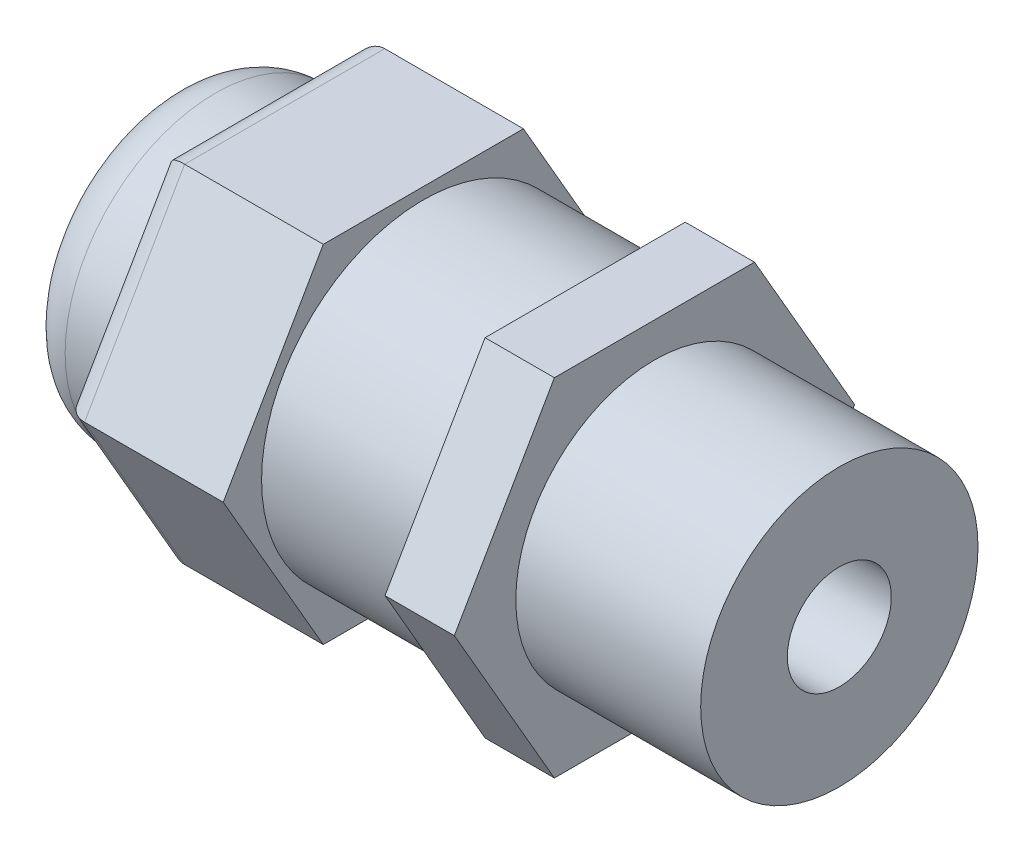
ISO-10303-21;
HEADER;
FILE_DESCRIPTION(('STEP AP214'),'2;1');
FILE_NAME('part.step','',(''),(''),'','','');
FILE_SCHEMA(('AUTOMOTIVE_DESIGN { 1 0 10303 214 1 1 1 1 }'));
ENDSEC;
DATA;
#1=APPLICATION_CONTEXT('core data for automotive mechanical design processes');
#2=APPLICATION_PROTOCOL_DEFINITION('international standard','automotive_design',2000,#1);
#3=PRODUCT_CONTEXT('',#1,'mechanical');
#4=PRODUCT('Part','Part','',(#3));
#5=PRODUCT_RELATED_PRODUCT_CATEGORY('part','',(#4));
#6=PRODUCT_DEFINITION_FORMATION('','',#4);
#7=PRODUCT_DEFINITION_CONTEXT('part definition',#1,'design');
#8=PRODUCT_DEFINITION('design','',#6,#7);
#9=PRODUCT_DEFINITION_SHAPE('','',#8);
#10=(LENGTH_UNIT() NAMED_UNIT(*) SI_UNIT(.MILLI.,.METRE.));
#11=(NAMED_UNIT(*) PLANE_ANGLE_UNIT() SI_UNIT($,.RADIAN.));
#12=(NAMED_UNIT(*) SI_UNIT($,.STERADIAN.) SOLID_ANGLE_UNIT());
#13=UNCERTAINTY_MEASURE_WITH_UNIT(LENGTH_MEASURE(1.E-05),#10,'distance_accuracy_value','');
#14=(GEOMETRIC_REPRESENTATION_CONTEXT(3) GLOBAL_UNCERTAINTY_ASSIGNED_CONTEXT((#13)) GLOBAL_UNIT_ASSIGNED_CONTEXT((#10,
#11,#12)) REPRESENTATION_CONTEXT('',''));
#15=CARTESIAN_POINT('',(0.,0.,0.));
#16=DIRECTION('',(0.,0.,1.));
#17=DIRECTION('',(1.,0.,0.));
#18=AXIS2_PLACEMENT_3D('',#15,#16,#17);
#19=CARTESIAN_POINT('',(-14.,0.,0.));
#20=DIRECTION('',(-1.,0.,0.));
#21=DIRECTION('',(0.,0.,1.));
#22=AXIS2_PLACEMENT_3D('',#19,#20,#21);
#23=PLANE('',#22);
#24=CARTESIAN_POINT('',(-14.,0.,0.));
#25=DIRECTION('',(-1.,0.,0.));
#26=DIRECTION('',(0.,0.,1.));
#27=AXIS2_PLACEMENT_3D('',#24,#25,#26);
#28=CIRCLE('',#27,6.5);
#29=CARTESIAN_POINT('',(-14.,6.49999999999999,0.));
#30=VERTEX_POINT('',#29);
#31=CARTESIAN_POINT('',(-14.,3.24999999999995,-5.62916512459887));
#32=VERTEX_POINT('',#31);
#33=EDGE_CURVE('E191',#30,#32,#28,.T.);
#34=ORIENTED_EDGE('',*,*,#33,.F.);
#35=DIRECTION('',(0.,0.,-1.));
#36=VECTOR('',#35,1.);
#37=CARTESIAN_POINT('',(-14.,6.49999999999997,-4.33012701892224));
#38=LINE('',#37,#36);
#39=CARTESIAN_POINT('',(-14.,6.49999999999997,-3.75277674973261));
#40=VERTEX_POINT('',#39);
#41=EDGE_CURVE('E297',#30,#40,#38,.T.);
#42=ORIENTED_EDGE('',*,*,#41,.T.);
#43=DIRECTION('',(0.,-0.866025403784443,-0.499999999999993));
#44=VECTOR('',#43,1.);
#45=CARTESIAN_POINT('',(-14.,-0.500000000000073,-7.79422863405994));
#46=LINE('',#45,#44);
#47=EDGE_CURVE('E294',#40,#32,#46,.T.);
#48=ORIENTED_EDGE('',*,*,#47,.T.);
#49=EDGE_LOOP('',(#34,#42,#48));
#50=FACE_BOUND('',#49,.T.);
#51=ADVANCED_FACE('F37',(#50),#23,.T.);
#52=CARTESIAN_POINT('',(-14.,-3.25000000000006,-5.62916512459881));
#53=VERTEX_POINT('',#52);
#54=EDGE_CURVE('E338',#32,#53,#28,.T.);
#55=ORIENTED_EDGE('',*,*,#54,.F.);
#56=DIRECTION('',(0.,-0.866025403784443,-0.499999999999993));
#57=VECTOR('',#56,1.);
#58=CARTESIAN_POINT('',(-14.,-0.500000000000073,-7.79422863405994));
#59=LINE('',#58,#57);
#60=CARTESIAN_POINT('',(-14.,0.,-7.50555349946513));
#61=VERTEX_POINT('',#60);
#62=EDGE_CURVE('E292',#32,#61,#59,.T.);
#63=ORIENTED_EDGE('',*,*,#62,.T.);
#64=DIRECTION('',(0.,-0.866025403784433,0.500000000000009));
#65=VECTOR('',#64,1.);
#66=CARTESIAN_POINT('',(-14.,-7.00000000000004,-3.46410161513767));
#67=LINE('',#66,#65);
#68=EDGE_CURVE('E290',#61,#53,#67,.T.);
#69=ORIENTED_EDGE('',*,*,#68,.T.);
#70=EDGE_LOOP('',(#55,#63,#69));
#71=FACE_BOUND('',#70,.T.);
#72=ADVANCED_FACE('F352',(#71),#23,.T.);
#73=CARTESIAN_POINT('',(-14.,-6.50000000000002,0.));
#74=VERTEX_POINT('',#73);
#75=EDGE_CURVE('E334',#53,#74,#28,.T.);
#76=ORIENTED_EDGE('',*,*,#75,.F.);
#77=DIRECTION('',(0.,-0.866025403784433,0.500000000000009));
#78=VECTOR('',#77,1.);
#79=CARTESIAN_POINT('',(-14.,-7.00000000000004,-3.46410161513767));
#80=LINE('',#79,#78);
#81=CARTESIAN_POINT('',(-14.,-6.50000000000005,-3.75277674973249));
#82=VERTEX_POINT('',#81);
#83=EDGE_CURVE('E288',#53,#82,#80,.T.);
#84=ORIENTED_EDGE('',*,*,#83,.T.);
#85=DIRECTION('',(0.,0.,1.));
#86=VECTOR('',#85,1.);
#87=CARTESIAN_POINT('',(-14.,-6.5,4.33012701892219));
#88=LINE('',#87,#86);
#89=EDGE_CURVE('E286',#82,#74,#88,.T.);
#90=ORIENTED_EDGE('',*,*,#89,.T.);
#91=EDGE_LOOP('',(#76,#84,#90));
#92=FACE_BOUND('',#91,.T.);
#93=ADVANCED_FACE('F357',(#92),#23,.T.);
#94=CARTESIAN_POINT('',(-14.,-3.24999999999999,5.62916512459885));
#95=VERTEX_POINT('',#94);
#96=EDGE_CURVE('E329',#74,#95,#28,.T.);
#97=ORIENTED_EDGE('',*,*,#96,.F.);
#98=DIRECTION('',(0.,0.,1.));
#99=VECTOR('',#98,1.);
#100=CARTESIAN_POINT('',(-14.,-6.5,4.33012701892219));
#101=LINE('',#100,#99);
#102=CARTESIAN_POINT('',(-14.,-6.5,3.75277674973256));
#103=VERTEX_POINT('',#102);
#104=EDGE_CURVE('E284',#74,#103,#101,.T.);
#105=ORIENTED_EDGE('',*,*,#104,.T.);
#106=DIRECTION('',(0.,0.866025403784439,0.499999999999999));
#107=VECTOR('',#106,1.);
#108=CARTESIAN_POINT('',(-14.,0.50000000000002,7.79422863405995));
#109=LINE('',#108,#107);
#110=EDGE_CURVE('E282',#103,#95,#109,.T.);
#111=ORIENTED_EDGE('',*,*,#110,.T.);
#112=EDGE_LOOP('',(#97,#105,#111));
#113=FACE_BOUND('',#112,.T.);
#114=ADVANCED_FACE('F361',(#113),#23,.T.);
#115=CARTESIAN_POINT('',(-14.,3.25000000000002,5.62916512459884));
#116=VERTEX_POINT('',#115);
#117=EDGE_CURVE('E193',#95,#116,#28,.T.);
#118=ORIENTED_EDGE('',*,*,#117,.F.);
#119=DIRECTION('',(0.,0.866025403784439,0.499999999999999));
#120=VECTOR('',#119,1.);
#121=CARTESIAN_POINT('',(-14.,0.50000000000002,7.79422863405995));
#122=LINE('',#121,#120);
#123=CARTESIAN_POINT('',(-14.,0.,7.50555349946513));
#124=VERTEX_POINT('',#123);
#125=EDGE_CURVE('E280',#95,#124,#122,.T.);
#126=ORIENTED_EDGE('',*,*,#125,.T.);
#127=DIRECTION('',(0.,0.866025403784437,-0.500000000000003));
#128=VECTOR('',#127,1.);
#129=CARTESIAN_POINT('',(-14.,7.00000000000002,3.46410161513772));
#130=LINE('',#129,#128);
#131=EDGE_CURVE('E276',#124,#116,#130,.T.);
#132=ORIENTED_EDGE('',*,*,#131,.T.);
#133=EDGE_LOOP('',(#118,#126,#132));
#134=FACE_BOUND('',#133,.T.);
#135=ADVANCED_FACE('F365',(#134),#23,.T.);
#136=CARTESIAN_POINT('',(11.,0.,0.));
#137=DIRECTION('',(-1.,0.,0.));
#138=DIRECTION('',(0.,0.,1.));
#139=AXIS2_PLACEMENT_3D('',#136,#137,#138);
#140=PLANE('',#139);
#141=CARTESIAN_POINT('',(11.,0.,0.));
#142=DIRECTION('',(-1.,0.,0.));
#143=DIRECTION('',(0.,0.,1.));
#144=AXIS2_PLACEMENT_3D('',#141,#142,#143);
#145=CIRCLE('',#144,2.25);
#146=CARTESIAN_POINT('',(11.,0.,2.25));
#147=VERTEX_POINT('',#146);
#148=EDGE_CURVE('E312',#147,#147,#145,.T.);
#149=ORIENTED_EDGE('',*,*,#148,.T.);
#150=EDGE_LOOP('',(#149));
#151=FACE_BOUND('',#150,.T.);
#152=CARTESIAN_POINT('',(11.,0.,0.));
#153=DIRECTION('',(-1.,0.,0.));
#154=DIRECTION('',(0.,0.,1.));
#155=AXIS2_PLACEMENT_3D('',#152,#153,#154);
#156=CIRCLE('',#155,6.);
#157=CARTESIAN_POINT('',(11.,0.,6.));
#158=VERTEX_POINT('',#157);
#159=EDGE_CURVE('E263',#158,#158,#156,.T.);
#160=ORIENTED_EDGE('',*,*,#159,.F.);
#161=EDGE_LOOP('',(#160));
#162=FACE_BOUND('',#161,.T.);
#163=ADVANCED_FACE('F409',(#151,#162),#140,.F.);
#164=CARTESIAN_POINT('',(-13.3953488372093,0.,0.));
#165=DIRECTION('',(-1.,0.,0.));
#166=DIRECTION('',(0.,0.,1.));
#167=AXIS2_PLACEMENT_3D('',#164,#165,#166);
#168=CYLINDRICAL_SURFACE('',#167,6.);
#169=CARTESIAN_POINT('',(3.,0.,0.));
#170=DIRECTION('',(1.,0.,0.));
#171=DIRECTION('',(0.,0.,-1.));
#172=AXIS2_PLACEMENT_3D('',#169,#170,#171);
#173=CIRCLE('',#172,6.);
#174=CARTESIAN_POINT('',(3.,0.,-6.));
#175=VERTEX_POINT('',#174);
#176=EDGE_CURVE('E259',#175,#175,#173,.T.);
#177=ORIENTED_EDGE('',*,*,#176,.T.);
#178=EDGE_LOOP('',(#177));
#179=FACE_BOUND('',#178,.T.);
#180=ORIENTED_EDGE('',*,*,#159,.T.);
#181=EDGE_LOOP('',(#180));
#182=FACE_BOUND('',#181,.T.);
#183=ADVANCED_FACE('F414',(#179,#182),#168,.T.);
#184=CARTESIAN_POINT('',(3.,-7.5,4.33012701892219));
#185=DIRECTION('',(0.,1.,0.));
#186=DIRECTION('',(0.,0.,1.));
#187=AXIS2_PLACEMENT_3D('',#184,#185,#186);
#188=PLANE('',#187);
#189=DIRECTION('',(0.,0.,-1.));
#190=VECTOR('',#189,1.);
#191=CARTESIAN_POINT('',(0.,-7.5,4.33012701892219));
#192=LINE('',#191,#190);
#193=CARTESIAN_POINT('',(0.,-7.5,4.33012701892219));
#194=VERTEX_POINT('',#193);
#195=CARTESIAN_POINT('',(0.,-7.5,-4.3301270189222));
#196=VERTEX_POINT('',#195);
#197=EDGE_CURVE('E172',#194,#196,#192,.T.);
#198=ORIENTED_EDGE('',*,*,#197,.T.);
#199=DIRECTION('',(-1.,0.,0.));
#200=VECTOR('',#199,1.);
#201=CARTESIAN_POINT('',(3.,-7.5,-4.3301270189222));
#202=LINE('',#201,#200);
#203=CARTESIAN_POINT('',(3.,-7.5,-4.3301270189222));
#204=VERTEX_POINT('',#203);
#205=EDGE_CURVE('E253',#204,#196,#202,.T.);
#206=ORIENTED_EDGE('',*,*,#205,.F.);
#207=DIRECTION('',(0.,0.,-1.));
#208=VECTOR('',#207,1.);
#209=CARTESIAN_POINT('',(3.,-7.5,4.33012701892219));
#210=LINE('',#209,#208);
#211=CARTESIAN_POINT('',(3.,-7.5,4.33012701892219));
#212=VERTEX_POINT('',#211);
#213=EDGE_CURVE('E213',#212,#204,#210,.T.);
#214=ORIENTED_EDGE('',*,*,#213,.F.);
#215=DIRECTION('',(-1.,0.,0.));
#216=VECTOR('',#215,1.);
#217=CARTESIAN_POINT('',(3.,-7.5,4.33012701892219));
#218=LINE('',#217,#216);
#219=EDGE_CURVE('E227',#212,#194,#218,.T.);
#220=ORIENTED_EDGE('',*,*,#219,.T.);
#221=EDGE_LOOP('',(#198,#206,#214,#220));
#222=FACE_BOUND('',#221,.T.);
#223=ADVANCED_FACE('F528',(#222),#188,.F.);
#224=CARTESIAN_POINT('',(3.,-7.5,-4.3301270189222));
#225=DIRECTION('',(0.,0.5,0.866025403784439));
#226=DIRECTION('',(0.,-0.866025403784439,0.5));
#227=AXIS2_PLACEMENT_3D('',#224,#225,#226);
#228=PLANE('',#227);
#229=DIRECTION('',(0.,0.866025403784439,-0.5));
#230=VECTOR('',#229,1.);
#231=CARTESIAN_POINT('',(0.,-7.5,-4.3301270189222));
#232=LINE('',#231,#230);
#233=CARTESIAN_POINT('',(0.,0.,-8.66025403784439));
#234=VERTEX_POINT('',#233);
#235=EDGE_CURVE('E230',#196,#234,#232,.T.);
#236=ORIENTED_EDGE('',*,*,#235,.T.);
#237=DIRECTION('',(-1.,0.,0.));
#238=VECTOR('',#237,1.);
#239=CARTESIAN_POINT('',(3.,0.,-8.66025403784439));
#240=LINE('',#239,#238);
#241=CARTESIAN_POINT('',(3.,0.,-8.66025403784439));
#242=VERTEX_POINT('',#241);
#243=EDGE_CURVE('E250',#242,#234,#240,.T.);
#244=ORIENTED_EDGE('',*,*,#243,.F.);
#245=DIRECTION('',(0.,0.866025403784439,-0.5));
#246=VECTOR('',#245,1.);
#247=CARTESIAN_POINT('',(3.,-7.5,-4.3301270189222));
#248=LINE('',#247,#246);
#249=EDGE_CURVE('E216',#204,#242,#248,.T.);
#250=ORIENTED_EDGE('',*,*,#249,.F.);
#251=ORIENTED_EDGE('',*,*,#205,.T.);
#252=EDGE_LOOP('',(#236,#244,#250,#251));
#253=FACE_BOUND('',#252,.T.);
#254=ADVANCED_FACE('F518',(#253),#228,.F.);
#255=CARTESIAN_POINT('',(3.,0.,-8.66025403784439));
#256=DIRECTION('',(0.,-0.5,0.866025403784438));
#257=DIRECTION('',(0.,-0.866025403784439,-0.5));
#258=AXIS2_PLACEMENT_3D('',#255,#256,#257);
#259=PLANE('',#258);
#260=DIRECTION('',(0.,0.866025403784439,0.5));
#261=VECTOR('',#260,1.);
#262=CARTESIAN_POINT('',(0.,0.,-8.66025403784439));
#263=LINE('',#262,#261);
#264=CARTESIAN_POINT('',(0.,7.5,-4.33012701892219));
#265=VERTEX_POINT('',#264);
#266=EDGE_CURVE('E232',#234,#265,#263,.T.);
#267=ORIENTED_EDGE('',*,*,#266,.T.);
#268=DIRECTION('',(-1.,0.,0.));
#269=VECTOR('',#268,1.);
#270=CARTESIAN_POINT('',(3.,7.5,-4.33012701892219));
#271=LINE('',#270,#269);
#272=CARTESIAN_POINT('',(3.,7.5,-4.33012701892219));
#273=VERTEX_POINT('',#272);
#274=EDGE_CURVE('E247',#273,#265,#271,.T.);
#275=ORIENTED_EDGE('',*,*,#274,.F.);
#276=DIRECTION('',(0.,0.866025403784439,0.5));
#277=VECTOR('',#276,1.);
#278=CARTESIAN_POINT('',(3.,0.,-8.66025403784439));
#279=LINE('',#278,#277);
#280=EDGE_CURVE('E219',#242,#273,#279,.T.);
#281=ORIENTED_EDGE('',*,*,#280,.F.);
#282=ORIENTED_EDGE('',*,*,#243,.T.);
#283=EDGE_LOOP('',(#267,#275,#281,#282));
#284=FACE_BOUND('',#283,.T.);
#285=ADVANCED_FACE('F508',(#284),#259,.F.);
#286=CARTESIAN_POINT('',(3.,7.5,-4.33012701892219));
#287=DIRECTION('',(0.,-1.,0.));
#288=DIRECTION('',(0.,0.,-1.));
#289=AXIS2_PLACEMENT_3D('',#286,#287,#288);
#290=PLANE('',#289);
#291=DIRECTION('',(0.,0.,1.));
#292=VECTOR('',#291,1.);
#293=CARTESIAN_POINT('',(0.,7.5,-4.33012701892219));
#294=LINE('',#293,#292);
#295=CARTESIAN_POINT('',(0.,7.5,4.3301270189222));
#296=VERTEX_POINT('',#295);
#297=EDGE_CURVE('E234',#265,#296,#294,.T.);
#298=ORIENTED_EDGE('',*,*,#297,.T.);
#299=DIRECTION('',(-1.,0.,0.));
#300=VECTOR('',#299,1.);
#301=CARTESIAN_POINT('',(3.,7.5,4.3301270189222));
#302=LINE('',#301,#300);
#303=CARTESIAN_POINT('',(3.,7.5,4.3301270189222));
#304=VERTEX_POINT('',#303);
#305=EDGE_CURVE('E244',#304,#296,#302,.T.);
#306=ORIENTED_EDGE('',*,*,#305,.F.);
#307=DIRECTION('',(0.,0.,1.));
#308=VECTOR('',#307,1.);
#309=CARTESIAN_POINT('',(3.,7.5,-4.33012701892219));
#310=LINE('',#309,#308);
#311=EDGE_CURVE('E221',#273,#304,#310,.T.);
#312=ORIENTED_EDGE('',*,*,#311,.F.);
#313=ORIENTED_EDGE('',*,*,#274,.T.);
#314=EDGE_LOOP('',(#298,#306,#312,#313));
#315=FACE_BOUND('',#314,.T.);
#316=ADVANCED_FACE('F498',(#315),#290,.F.);
#317=CARTESIAN_POINT('',(3.,7.5,4.3301270189222));
#318=DIRECTION('',(0.,-0.5,-0.866025403784439));
#319=DIRECTION('',(0.,0.866025403784439,-0.5));
#320=AXIS2_PLACEMENT_3D('',#317,#318,#319);
#321=PLANE('',#320);
#322=DIRECTION('',(0.,-0.866025403784439,0.5));
#323=VECTOR('',#322,1.);
#324=CARTESIAN_POINT('',(0.,7.5,4.3301270189222));
#325=LINE('',#324,#323);
#326=CARTESIAN_POINT('',(0.,0.,8.66025403784439));
#327=VERTEX_POINT('',#326);
#328=EDGE_CURVE('E236',#296,#327,#325,.T.);
#329=ORIENTED_EDGE('',*,*,#328,.T.);
#330=DIRECTION('',(-1.,0.,0.));
#331=VECTOR('',#330,1.);
#332=CARTESIAN_POINT('',(3.,0.,8.66025403784439));
#333=LINE('',#332,#331);
#334=CARTESIAN_POINT('',(3.,0.,8.66025403784439));
#335=VERTEX_POINT('',#334);
#336=EDGE_CURVE('E241',#335,#327,#333,.T.);
#337=ORIENTED_EDGE('',*,*,#336,.F.);
#338=DIRECTION('',(0.,-0.866025403784439,0.5));
#339=VECTOR('',#338,1.);
#340=CARTESIAN_POINT('',(3.,7.5,4.3301270189222));
#341=LINE('',#340,#339);
#342=EDGE_CURVE('E223',#304,#335,#341,.T.);
#343=ORIENTED_EDGE('',*,*,#342,.F.);
#344=ORIENTED_EDGE('',*,*,#305,.T.);
#345=EDGE_LOOP('',(#329,#337,#343,#344));
#346=FACE_BOUND('',#345,.T.);
#347=ADVANCED_FACE('F488',(#346),#321,.F.);
#348=CARTESIAN_POINT('',(3.,0.,8.66025403784439));
#349=DIRECTION('',(0.,0.5,-0.866025403784438));
#350=DIRECTION('',(0.,0.866025403784439,0.5));
#351=AXIS2_PLACEMENT_3D('',#348,#349,#350);
#352=PLANE('',#351);
#353=DIRECTION('',(0.,-0.866025403784439,-0.5));
#354=VECTOR('',#353,1.);
#355=CARTESIAN_POINT('',(0.,0.,8.66025403784439));
#356=LINE('',#355,#354);
#357=EDGE_CURVE('E217',#327,#194,#356,.T.);
#358=ORIENTED_EDGE('',*,*,#357,.T.);
#359=ORIENTED_EDGE('',*,*,#219,.F.);
#360=DIRECTION('',(0.,-0.866025403784439,-0.5));
#361=VECTOR('',#360,1.);
#362=CARTESIAN_POINT('',(3.,0.,8.66025403784439));
#363=LINE('',#362,#361);
#364=EDGE_CURVE('E225',#335,#212,#363,.T.);
#365=ORIENTED_EDGE('',*,*,#364,.F.);
#366=ORIENTED_EDGE('',*,*,#336,.T.);
#367=EDGE_LOOP('',(#358,#359,#365,#366));
#368=FACE_BOUND('',#367,.T.);
#369=ADVANCED_FACE('F478',(#368),#352,.F.);
#370=CARTESIAN_POINT('',(3.,0.,0.));
#371=DIRECTION('',(1.,0.,0.));
#372=DIRECTION('',(0.,0.,-1.));
#373=AXIS2_PLACEMENT_3D('',#370,#371,#372);
#374=PLANE('',#373);
#375=ORIENTED_EDGE('',*,*,#176,.F.);
#376=EDGE_LOOP('',(#375));
#377=FACE_BOUND('',#376,.T.);
#378=ORIENTED_EDGE('',*,*,#213,.T.);
#379=ORIENTED_EDGE('',*,*,#249,.T.);
#380=ORIENTED_EDGE('',*,*,#280,.T.);
#381=ORIENTED_EDGE('',*,*,#311,.T.);
#382=ORIENTED_EDGE('',*,*,#342,.T.);
#383=ORIENTED_EDGE('',*,*,#364,.T.);
#384=EDGE_LOOP('',(#378,#379,#380,#381,#382,#383));
#385=FACE_BOUND('',#384,.T.);
#386=ADVANCED_FACE('F466',(#377,#385),#374,.T.);
#387=CARTESIAN_POINT('',(0.,0.,0.));
#388=DIRECTION('',(1.,0.,0.));
#389=DIRECTION('',(0.,0.,-1.));
#390=AXIS2_PLACEMENT_3D('',#387,#388,#389);
#391=PLANE('',#390);
#392=CARTESIAN_POINT('',(0.,0.,0.));
#393=DIRECTION('',(1.,0.,0.));
#394=DIRECTION('',(0.,0.,-1.));
#395=AXIS2_PLACEMENT_3D('',#392,#393,#394);
#396=CIRCLE('',#395,7.);
#397=CARTESIAN_POINT('',(0.,0.,-7.));
#398=VERTEX_POINT('',#397);
#399=EDGE_CURVE('E256',#398,#398,#396,.T.);
#400=ORIENTED_EDGE('',*,*,#399,.T.);
#401=EDGE_LOOP('',(#400));
#402=FACE_BOUND('',#401,.T.);
#403=ORIENTED_EDGE('',*,*,#197,.F.);
#404=ORIENTED_EDGE('',*,*,#357,.F.);
#405=ORIENTED_EDGE('',*,*,#328,.F.);
#406=ORIENTED_EDGE('',*,*,#297,.F.);
#407=ORIENTED_EDGE('',*,*,#266,.F.);
#408=ORIENTED_EDGE('',*,*,#235,.F.);
#409=EDGE_LOOP('',(#403,#404,#405,#406,#407,#408));
#410=FACE_BOUND('',#409,.T.);
#411=ADVANCED_FACE('F460',(#402,#410),#391,.F.);
#412=CARTESIAN_POINT('',(-13.3953488372093,0.,0.));
#413=DIRECTION('',(-1.,0.,0.));
#414=DIRECTION('',(0.,0.,1.));
#415=AXIS2_PLACEMENT_3D('',#412,#413,#414);
#416=CYLINDRICAL_SURFACE('',#415,7.);
#417=CARTESIAN_POINT('',(-7.,0.,0.));
#418=DIRECTION('',(-1.,0.,0.));
#419=DIRECTION('',(0.,0.,1.));
#420=AXIS2_PLACEMENT_3D('',#417,#418,#419);
#421=CIRCLE('',#420,7.);
#422=CARTESIAN_POINT('',(-7.,0.,7.));
#423=VERTEX_POINT('',#422);
#424=EDGE_CURVE('E260',#423,#423,#421,.T.);
#425=ORIENTED_EDGE('',*,*,#424,.F.);
#426=EDGE_LOOP('',(#425));
#427=FACE_BOUND('',#426,.T.);
#428=ORIENTED_EDGE('',*,*,#399,.F.);
#429=EDGE_LOOP('',(#428));
#430=FACE_BOUND('',#429,.T.);
#431=ADVANCED_FACE('F465',(#427,#430),#416,.T.);
#432=CARTESIAN_POINT('',(-14.,-7.50000000000005,-4.3301270189221));
#433=DIRECTION('',(0.,1.,0.));
#434=DIRECTION('',(0.,0.,1.));
#435=AXIS2_PLACEMENT_3D('',#432,#433,#434);
#436=PLANE('',#435);
#437=DIRECTION('',(1.,0.,0.));
#438=VECTOR('',#437,1.);
#439=CARTESIAN_POINT('',(-14.,-7.5,4.33012701892219));
#440=LINE('',#439,#438);
#441=CARTESIAN_POINT('',(-13.,-7.5,4.33012701892219));
#442=VERTEX_POINT('',#441);
#443=CARTESIAN_POINT('',(-7.,-7.5,4.33012701892219));
#444=VERTEX_POINT('',#443);
#445=EDGE_CURVE('E162',#442,#444,#440,.T.);
#446=ORIENTED_EDGE('',*,*,#445,.F.);
#447=DIRECTION('',(0.,0.,1.));
#448=VECTOR('',#447,1.);
#449=CARTESIAN_POINT('',(-13.,-7.50000000000005,-4.3301270189221));
#450=LINE('',#449,#448);
#451=CARTESIAN_POINT('',(-13.,-7.50000000000005,-4.3301270189221));
#452=VERTEX_POINT('',#451);
#453=EDGE_CURVE('E304',#442,#452,#450,.F.);
#454=ORIENTED_EDGE('',*,*,#453,.T.);
#455=DIRECTION('',(1.,0.,0.));
#456=VECTOR('',#455,1.);
#457=CARTESIAN_POINT('',(-14.,-7.50000000000005,-4.3301270189221));
#458=LINE('',#457,#456);
#459=CARTESIAN_POINT('',(-7.,-7.50000000000005,-4.3301270189221));
#460=VERTEX_POINT('',#459);
#461=EDGE_CURVE('E186',#452,#460,#458,.T.);
#462=ORIENTED_EDGE('',*,*,#461,.T.);
#463=DIRECTION('',(0.,0.,1.));
#464=VECTOR('',#463,1.);
#465=CARTESIAN_POINT('',(-7.,-7.50000000000005,-4.3301270189221));
#466=LINE('',#465,#464);
#467=EDGE_CURVE('E179',#460,#444,#466,.T.);
#468=ORIENTED_EDGE('',*,*,#467,.T.);
#469=EDGE_LOOP('',(#446,#454,#462,#468));
#470=FACE_BOUND('',#469,.T.);
#471=ADVANCED_FACE('F184',(#470),#436,.F.);
#472=CARTESIAN_POINT('',(-14.,-7.5,4.33012701892219));
#473=DIRECTION('',(0.,0.499999999999999,-0.866025403784439));
#474=DIRECTION('',(0.,0.866025403784439,0.499999999999999));
#475=AXIS2_PLACEMENT_3D('',#472,#473,#474);
#476=PLANE('',#475);
#477=DIRECTION('',(1.,0.,0.));
#478=VECTOR('',#477,1.);
#479=CARTESIAN_POINT('',(-14.,0.,8.66025403784439));
#480=LINE('',#479,#478);
#481=CARTESIAN_POINT('',(-13.,0.,8.66025403784439));
#482=VERTEX_POINT('',#481);
#483=CARTESIAN_POINT('',(-7.,0.,8.66025403784439));
#484=VERTEX_POINT('',#483);
#485=EDGE_CURVE('E173',#482,#484,#480,.T.);
#486=ORIENTED_EDGE('',*,*,#485,.F.);
#487=DIRECTION('',(0.,0.866025403784439,0.499999999999999));
#488=VECTOR('',#487,1.);
#489=CARTESIAN_POINT('',(-13.,-7.5,4.33012701892219));
#490=LINE('',#489,#488);
#491=EDGE_CURVE('E168',#482,#442,#490,.F.);
#492=ORIENTED_EDGE('',*,*,#491,.T.);
#493=ORIENTED_EDGE('',*,*,#445,.T.);
#494=DIRECTION('',(0.,0.866025403784439,0.499999999999999));
#495=VECTOR('',#494,1.);
#496=CARTESIAN_POINT('',(-7.,-7.5,4.33012701892219));
#497=LINE('',#496,#495);
#498=EDGE_CURVE('E165',#444,#484,#497,.T.);
#499=ORIENTED_EDGE('',*,*,#498,.T.);
#500=EDGE_LOOP('',(#486,#492,#493,#499));
#501=FACE_BOUND('',#500,.T.);
#502=ADVANCED_FACE('F164',(#501),#476,.F.);
#503=CARTESIAN_POINT('',(-14.,0.,8.66025403784439));
#504=DIRECTION('',(0.,-0.500000000000003,-0.866025403784437));
#505=DIRECTION('',(0.,0.866025403784437,-0.500000000000003));
#506=AXIS2_PLACEMENT_3D('',#503,#504,#505);
#507=PLANE('',#506);
#508=DIRECTION('',(1.,0.,0.));
#509=VECTOR('',#508,1.);
#510=CARTESIAN_POINT('',(-14.,7.50000000000002,4.33012701892216));
#511=LINE('',#510,#509);
#512=CARTESIAN_POINT('',(-13.,7.50000000000002,4.33012701892216));
#513=VERTEX_POINT('',#512);
#514=CARTESIAN_POINT('',(-7.,7.50000000000002,4.33012701892216));
#515=VERTEX_POINT('',#514);
#516=EDGE_CURVE('E210',#513,#515,#511,.T.);
#517=ORIENTED_EDGE('',*,*,#516,.F.);
#518=DIRECTION('',(0.,0.866025403784437,-0.500000000000003));
#519=VECTOR('',#518,1.);
#520=CARTESIAN_POINT('',(-13.,0.,8.66025403784439));
#521=LINE('',#520,#519);
#522=EDGE_CURVE('E11',#513,#482,#521,.F.);
#523=ORIENTED_EDGE('',*,*,#522,.T.);
#524=ORIENTED_EDGE('',*,*,#485,.T.);
#525=DIRECTION('',(0.,0.866025403784437,-0.500000000000003));
#526=VECTOR('',#525,1.);
#527=CARTESIAN_POINT('',(-7.,0.,8.66025403784439));
#528=LINE('',#527,#526);
#529=EDGE_CURVE('E182',#484,#515,#528,.T.);
#530=ORIENTED_EDGE('',*,*,#529,.T.);
#531=EDGE_LOOP('',(#517,#523,#524,#530));
#532=FACE_BOUND('',#531,.T.);
#533=ADVANCED_FACE('F385',(#532),#507,.F.);
#534=CARTESIAN_POINT('',(-14.,7.50000000000002,4.33012701892216));
#535=DIRECTION('',(0.,-1.,0.));
#536=DIRECTION('',(0.,0.,-1.));
#537=AXIS2_PLACEMENT_3D('',#534,#535,#536);
#538=PLANE('',#537);
#539=DIRECTION('',(1.,0.,0.));
#540=VECTOR('',#539,1.);
#541=CARTESIAN_POINT('',(-14.,7.49999999999997,-4.33012701892225));
#542=LINE('',#541,#540);
#543=CARTESIAN_POINT('',(-13.,7.49999999999997,-4.33012701892225));
#544=VERTEX_POINT('',#543);
#545=CARTESIAN_POINT('',(-7.,7.49999999999997,-4.33012701892225));
#546=VERTEX_POINT('',#545);
#547=EDGE_CURVE('E208',#544,#546,#542,.T.);
#548=ORIENTED_EDGE('',*,*,#547,.F.);
#549=DIRECTION('',(0.,0.,-1.));
#550=VECTOR('',#549,1.);
#551=CARTESIAN_POINT('',(-13.,7.50000000000002,4.33012701892216));
#552=LINE('',#551,#550);
#553=EDGE_CURVE('E46',#544,#513,#552,.F.);
#554=ORIENTED_EDGE('',*,*,#553,.T.);
#555=ORIENTED_EDGE('',*,*,#516,.T.);
#556=DIRECTION('',(0.,0.,-1.));
#557=VECTOR('',#556,1.);
#558=CARTESIAN_POINT('',(-7.,7.50000000000002,4.33012701892216));
#559=LINE('',#558,#557);
#560=EDGE_CURVE('E197',#515,#546,#559,.T.);
#561=ORIENTED_EDGE('',*,*,#560,.T.);
#562=EDGE_LOOP('',(#548,#554,#555,#561));
#563=FACE_BOUND('',#562,.T.);
#564=ADVANCED_FACE('F384',(#563),#538,.F.);
#565=CARTESIAN_POINT('',(-14.,7.49999999999997,-4.33012701892225));
#566=DIRECTION('',(0.,-0.499999999999993,0.866025403784443));
#567=DIRECTION('',(0.,-0.866025403784443,-0.499999999999993));
#568=AXIS2_PLACEMENT_3D('',#565,#566,#567);
#569=PLANE('',#568);
#570=DIRECTION('',(1.,0.,0.));
#571=VECTOR('',#570,1.);
#572=CARTESIAN_POINT('',(-14.,0.,-8.66025403784439));
#573=LINE('',#572,#571);
#574=CARTESIAN_POINT('',(-13.,0.,-8.66025403784439));
#575=VERTEX_POINT('',#574);
#576=CARTESIAN_POINT('',(-7.,0.,-8.66025403784439));
#577=VERTEX_POINT('',#576);
#578=EDGE_CURVE('E206',#575,#577,#573,.T.);
#579=ORIENTED_EDGE('',*,*,#578,.F.);
#580=DIRECTION('',(0.,-0.866025403784443,-0.499999999999993));
#581=VECTOR('',#580,1.);
#582=CARTESIAN_POINT('',(-13.,7.49999999999997,-4.33012701892225));
#583=LINE('',#582,#581);
#584=EDGE_CURVE('E299',#575,#544,#583,.F.);
#585=ORIENTED_EDGE('',*,*,#584,.T.);
#586=ORIENTED_EDGE('',*,*,#547,.T.);
#587=DIRECTION('',(0.,-0.866025403784443,-0.499999999999993));
#588=VECTOR('',#587,1.);
#589=CARTESIAN_POINT('',(-7.,7.49999999999997,-4.33012701892225));
#590=LINE('',#589,#588);
#591=EDGE_CURVE('E200',#546,#577,#590,.T.);
#592=ORIENTED_EDGE('',*,*,#591,.T.);
#593=EDGE_LOOP('',(#579,#585,#586,#592));
#594=FACE_BOUND('',#593,.T.);
#595=ADVANCED_FACE('F382',(#594),#569,.F.);
#596=CARTESIAN_POINT('',(-14.,0.,-8.66025403784439));
#597=DIRECTION('',(0.,0.500000000000009,0.866025403784433));
#598=DIRECTION('',(0.,-0.866025403784433,0.500000000000009));
#599=AXIS2_PLACEMENT_3D('',#596,#597,#598);
#600=PLANE('',#599);
#601=ORIENTED_EDGE('',*,*,#461,.F.);
#602=DIRECTION('',(0.,-0.866025403784433,0.500000000000009));
#603=VECTOR('',#602,1.);
#604=CARTESIAN_POINT('',(-13.,0.,-8.66025403784439));
#605=LINE('',#604,#603);
#606=EDGE_CURVE('E302',#452,#575,#605,.F.);
#607=ORIENTED_EDGE('',*,*,#606,.T.);
#608=ORIENTED_EDGE('',*,*,#578,.T.);
#609=DIRECTION('',(0.,-0.866025403784433,0.500000000000009));
#610=VECTOR('',#609,1.);
#611=CARTESIAN_POINT('',(-7.,0.,-8.66025403784439));
#612=LINE('',#611,#610);
#613=EDGE_CURVE('E203',#577,#460,#612,.T.);
#614=ORIENTED_EDGE('',*,*,#613,.T.);
#615=EDGE_LOOP('',(#601,#607,#608,#614));
#616=FACE_BOUND('',#615,.T.);
#617=ADVANCED_FACE('F381',(#616),#600,.F.);
#618=DIRECTION('',(0.,0.866025403784437,-0.500000000000003));
#619=VECTOR('',#618,1.);
#620=CARTESIAN_POINT('',(-14.,7.00000000000002,3.46410161513772));
#621=LINE('',#620,#619);
#622=CARTESIAN_POINT('',(-14.,6.50000000000002,3.75277674973254));
#623=VERTEX_POINT('',#622);
#624=EDGE_CURVE('E274',#116,#623,#621,.T.);
#625=ORIENTED_EDGE('',*,*,#624,.T.);
#626=DIRECTION('',(0.,0.,-1.));
#627=VECTOR('',#626,1.);
#628=CARTESIAN_POINT('',(-14.,6.49999999999997,-4.33012701892224));
#629=LINE('',#628,#627);
#630=EDGE_CURVE('E278',#623,#30,#629,.T.);
#631=ORIENTED_EDGE('',*,*,#630,.T.);
#632=EDGE_CURVE('E188',#116,#30,#28,.T.);
#633=ORIENTED_EDGE('',*,*,#632,.F.);
#634=EDGE_LOOP('',(#625,#631,#633));
#635=FACE_BOUND('',#634,.T.);
#636=ADVANCED_FACE('F371',(#635),#23,.T.);
#637=CARTESIAN_POINT('',(-7.,0.,0.));
#638=DIRECTION('',(-1.,0.,0.));
#639=DIRECTION('',(0.,0.,1.));
#640=AXIS2_PLACEMENT_3D('',#637,#638,#639);
#641=PLANE('',#640);
#642=ORIENTED_EDGE('',*,*,#424,.T.);
#643=EDGE_LOOP('',(#642));
#644=FACE_BOUND('',#643,.T.);
#645=ORIENTED_EDGE('',*,*,#467,.F.);
#646=ORIENTED_EDGE('',*,*,#613,.F.);
#647=ORIENTED_EDGE('',*,*,#591,.F.);
#648=ORIENTED_EDGE('',*,*,#560,.F.);
#649=ORIENTED_EDGE('',*,*,#529,.F.);
#650=ORIENTED_EDGE('',*,*,#498,.F.);
#651=EDGE_LOOP('',(#645,#646,#647,#648,#649,#650));
#652=FACE_BOUND('',#651,.T.);
#653=ADVANCED_FACE('F177',(#644,#652),#641,.F.);
#654=CARTESIAN_POINT('',(-18.,0.,0.));
#655=DIRECTION('',(1.,0.,0.));
#656=DIRECTION('',(0.,0.,-1.));
#657=AXIS2_PLACEMENT_3D('',#654,#655,#656);
#658=CYLINDRICAL_SURFACE('',#657,6.5);
#659=CARTESIAN_POINT('',(-16.,0.,0.));
#660=DIRECTION('',(-1.,0.,0.));
#661=DIRECTION('',(0.,0.,1.));
#662=AXIS2_PLACEMENT_3D('',#659,#660,#661);
#663=CIRCLE('',#662,6.5);
#664=CARTESIAN_POINT('',(-16.,0.,6.5));
#665=VERTEX_POINT('',#664);
#666=EDGE_CURVE('E271',#665,#665,#663,.F.);
#667=ORIENTED_EDGE('',*,*,#666,.T.);
#668=EDGE_LOOP('',(#667));
#669=FACE_BOUND('',#668,.T.);
#670=ORIENTED_EDGE('',*,*,#632,.T.);
#671=ORIENTED_EDGE('',*,*,#33,.T.);
#672=ORIENTED_EDGE('',*,*,#54,.T.);
#673=ORIENTED_EDGE('',*,*,#75,.T.);
#674=ORIENTED_EDGE('',*,*,#96,.T.);
#675=ORIENTED_EDGE('',*,*,#117,.T.);
#676=EDGE_LOOP('',(#670,#671,#672,#673,#674,#675));
#677=FACE_BOUND('',#676,.T.);
#678=ADVANCED_FACE('F345',(#669,#677),#658,.T.);
#679=CARTESIAN_POINT('',(-18.,0.,0.));
#680=DIRECTION('',(-1.,0.,0.));
#681=DIRECTION('',(0.,0.,1.));
#682=AXIS2_PLACEMENT_3D('',#679,#680,#681);
#683=PLANE('',#682);
#684=CARTESIAN_POINT('',(-18.,0.,0.));
#685=DIRECTION('',(-1.,0.,0.));
#686=DIRECTION('',(0.,0.,1.));
#687=AXIS2_PLACEMENT_3D('',#684,#685,#686);
#688=CIRCLE('',#687,2.25);
#689=CARTESIAN_POINT('',(-18.,0.,2.25));
#690=VERTEX_POINT('',#689);
#691=EDGE_CURVE('E668',#690,#690,#688,.T.);
#692=ORIENTED_EDGE('',*,*,#691,.F.);
#693=EDGE_LOOP('',(#692));
#694=FACE_BOUND('',#693,.T.);
#695=CARTESIAN_POINT('',(-18.,0.,0.));
#696=DIRECTION('',(-1.,0.,0.));
#697=DIRECTION('',(0.,0.,1.));
#698=AXIS2_PLACEMENT_3D('',#695,#696,#697);
#699=CIRCLE('',#698,4.5);
#700=CARTESIAN_POINT('',(-18.,0.,4.5));
#701=VERTEX_POINT('',#700);
#702=EDGE_CURVE('E266',#701,#701,#699,.T.);
#703=ORIENTED_EDGE('',*,*,#702,.T.);
#704=EDGE_LOOP('',(#703));
#705=FACE_BOUND('',#704,.T.);
#706=ADVANCED_FACE('F441',(#694,#705),#683,.T.);
#707=CARTESIAN_POINT('',(-16.,0.,0.));
#708=DIRECTION('',(-1.,0.,0.));
#709=DIRECTION('',(0.,0.,1.));
#710=AXIS2_PLACEMENT_3D('',#707,#708,#709);
#711=TOROIDAL_SURFACE('',#710,4.5,2.);
#712=ORIENTED_EDGE('',*,*,#666,.F.);
#713=EDGE_LOOP('',(#712));
#714=FACE_BOUND('',#713,.T.);
#715=ORIENTED_EDGE('',*,*,#702,.F.);
#716=EDGE_LOOP('',(#715));
#717=FACE_BOUND('',#716,.T.);
#718=ADVANCED_FACE('F436',(#714,#717),#711,.T.);
#719=CARTESIAN_POINT('',(-13.,-3.24999999999999,5.62916512459885));
#720=DIRECTION('',(0.,-0.866025403784439,-0.499999999999999));
#721=DIRECTION('',(0.,0.499999999999999,-0.866025403784439));
#722=AXIS2_PLACEMENT_3D('',#719,#720,#721);
#723=CYLINDRICAL_SURFACE('',#722,1.);
#724=CARTESIAN_POINT('',(-13.,-6.5,3.75277674973256));
#725=DIRECTION('',(0.,-0.500000000000003,-0.866025403784437));
#726=DIRECTION('',(0.,-0.866025403784437,0.500000000000003));
#727=AXIS2_PLACEMENT_3D('',#724,#725,#726);
#728=ELLIPSE('',#727,1.15470053837925,1.);
#729=EDGE_CURVE('E319',#442,#103,#728,.T.);
#730=ORIENTED_EDGE('',*,*,#729,.F.);
#731=ORIENTED_EDGE('',*,*,#491,.F.);
#732=CARTESIAN_POINT('',(-13.,0.,7.50555349946513));
#733=DIRECTION('',(0.,-1.,0.));
#734=DIRECTION('',(0.,0.,1.));
#735=AXIS2_PLACEMENT_3D('',#732,#733,#734);
#736=ELLIPSE('',#735,1.15470053837925,1.);
#737=EDGE_CURVE('E41',#124,#482,#736,.F.);
#738=ORIENTED_EDGE('',*,*,#737,.F.);
#739=ORIENTED_EDGE('',*,*,#125,.F.);
#740=ORIENTED_EDGE('',*,*,#110,.F.);
#741=EDGE_LOOP('',(#730,#731,#738,#739,#740));
#742=FACE_BOUND('',#741,.T.);
#743=ADVANCED_FACE('F39',(#742),#723,.T.);
#744=CARTESIAN_POINT('',(-13.,3.25000000000002,5.62916512459884));
#745=DIRECTION('',(0.,-0.866025403784437,0.500000000000003));
#746=DIRECTION('',(0.,-0.500000000000003,-0.866025403784437));
#747=AXIS2_PLACEMENT_3D('',#744,#745,#746);
#748=CYLINDRICAL_SURFACE('',#747,1.);
#749=ORIENTED_EDGE('',*,*,#737,.T.);
#750=ORIENTED_EDGE('',*,*,#522,.F.);
#751=CARTESIAN_POINT('',(-13.,6.50000000000002,3.75277674973254));
#752=DIRECTION('',(0.,-0.499999999999996,0.866025403784441));
#753=DIRECTION('',(0.,-0.866025403784441,-0.499999999999996));
#754=AXIS2_PLACEMENT_3D('',#751,#752,#753);
#755=ELLIPSE('',#754,1.15470053837925,1.);
#756=EDGE_CURVE('E317',#623,#513,#755,.F.);
#757=ORIENTED_EDGE('',*,*,#756,.F.);
#758=ORIENTED_EDGE('',*,*,#624,.F.);
#759=ORIENTED_EDGE('',*,*,#131,.F.);
#760=EDGE_LOOP('',(#749,#750,#757,#758,#759));
#761=FACE_BOUND('',#760,.T.);
#762=ADVANCED_FACE('F367',(#761),#748,.T.);
#763=CARTESIAN_POINT('',(-13.,-6.50000000000002,0.));
#764=DIRECTION('',(0.,0.,-1.));
#765=DIRECTION('',(0.,1.,0.));
#766=AXIS2_PLACEMENT_3D('',#763,#764,#765);
#767=CYLINDRICAL_SURFACE('',#766,1.);
#768=ORIENTED_EDGE('',*,*,#104,.F.);
#769=ORIENTED_EDGE('',*,*,#89,.F.);
#770=CARTESIAN_POINT('',(-13.,-6.50000000000005,-3.75277674973249));
#771=DIRECTION('',(0.,0.499999999999993,-0.866025403784443));
#772=DIRECTION('',(0.,-0.866025403784443,-0.499999999999993));
#773=AXIS2_PLACEMENT_3D('',#770,#771,#772);
#774=ELLIPSE('',#773,1.15470053837925,1.);
#775=EDGE_CURVE('E314',#452,#82,#774,.T.);
#776=ORIENTED_EDGE('',*,*,#775,.F.);
#777=ORIENTED_EDGE('',*,*,#453,.F.);
#778=ORIENTED_EDGE('',*,*,#729,.T.);
#779=EDGE_LOOP('',(#768,#769,#776,#777,#778));
#780=FACE_BOUND('',#779,.T.);
#781=ADVANCED_FACE('F386',(#780),#767,.T.);
#782=CARTESIAN_POINT('',(-13.,6.49999999999999,0.));
#783=DIRECTION('',(0.,0.,1.));
#784=DIRECTION('',(0.,-1.,0.));
#785=AXIS2_PLACEMENT_3D('',#782,#783,#784);
#786=CYLINDRICAL_SURFACE('',#785,1.);
#787=ORIENTED_EDGE('',*,*,#756,.T.);
#788=ORIENTED_EDGE('',*,*,#553,.F.);
#789=CARTESIAN_POINT('',(-13.,6.49999999999997,-3.75277674973261));
#790=DIRECTION('',(0.,0.500000000000006,0.866025403784435));
#791=DIRECTION('',(0.,-0.866025403784435,0.500000000000006));
#792=AXIS2_PLACEMENT_3D('',#789,#790,#791);
#793=ELLIPSE('',#792,1.15470053837925,1.);
#794=EDGE_CURVE('E311',#40,#544,#793,.F.);
#795=ORIENTED_EDGE('',*,*,#794,.F.);
#796=ORIENTED_EDGE('',*,*,#41,.F.);
#797=ORIENTED_EDGE('',*,*,#630,.F.);
#798=EDGE_LOOP('',(#787,#788,#795,#796,#797));
#799=FACE_BOUND('',#798,.T.);
#800=ADVANCED_FACE('F373',(#799),#786,.T.);
#801=CARTESIAN_POINT('',(-13.,-3.25000000000006,-5.62916512459881));
#802=DIRECTION('',(0.,0.866025403784433,-0.500000000000009));
#803=DIRECTION('',(0.,0.500000000000009,0.866025403784433));
#804=AXIS2_PLACEMENT_3D('',#801,#802,#803);
#805=CYLINDRICAL_SURFACE('',#804,1.);
#806=ORIENTED_EDGE('',*,*,#83,.F.);
#807=ORIENTED_EDGE('',*,*,#68,.F.);
#808=CARTESIAN_POINT('',(-13.,0.,-7.50555349946513));
#809=DIRECTION('',(0.,1.,0.));
#810=DIRECTION('',(0.,0.,-1.));
#811=AXIS2_PLACEMENT_3D('',#808,#809,#810);
#812=ELLIPSE('',#811,1.15470053837925,1.);
#813=EDGE_CURVE('E308',#575,#61,#812,.T.);
#814=ORIENTED_EDGE('',*,*,#813,.F.);
#815=ORIENTED_EDGE('',*,*,#606,.F.);
#816=ORIENTED_EDGE('',*,*,#775,.T.);
#817=EDGE_LOOP('',(#806,#807,#814,#815,#816));
#818=FACE_BOUND('',#817,.T.);
#819=ADVANCED_FACE('F379',(#818),#805,.T.);
#820=CARTESIAN_POINT('',(-13.,3.24999999999995,-5.62916512459887));
#821=DIRECTION('',(0.,0.866025403784443,0.499999999999993));
#822=DIRECTION('',(0.,-0.499999999999993,0.866025403784443));
#823=AXIS2_PLACEMENT_3D('',#820,#821,#822);
#824=CYLINDRICAL_SURFACE('',#823,1.);
#825=ORIENTED_EDGE('',*,*,#794,.T.);
#826=ORIENTED_EDGE('',*,*,#584,.F.);
#827=ORIENTED_EDGE('',*,*,#813,.T.);
#828=ORIENTED_EDGE('',*,*,#62,.F.);
#829=ORIENTED_EDGE('',*,*,#47,.F.);
#830=EDGE_LOOP('',(#825,#826,#827,#828,#829));
#831=FACE_BOUND('',#830,.T.);
#832=ADVANCED_FACE('F375',(#831),#824,.T.);
#833=CARTESIAN_POINT('',(11.,0.,0.));
#834=DIRECTION('',(-1.,0.,0.));
#835=DIRECTION('',(0.,0.,1.));
#836=AXIS2_PLACEMENT_3D('',#833,#834,#835);
#837=CYLINDRICAL_SURFACE('',#836,2.25);
#838=ORIENTED_EDGE('',*,*,#148,.F.);
#839=EDGE_LOOP('',(#838));
#840=FACE_BOUND('',#839,.T.);
#841=ORIENTED_EDGE('',*,*,#691,.T.);
#842=EDGE_LOOP('',(#841));
#843=FACE_BOUND('',#842,.T.);
#844=ADVANCED_FACE('F638',(#840,#843),#837,.F.);
#845=CLOSED_SHELL('',(#51,#72,#93,#114,#135,#163,#183,#223,#254,#285,#316,#347,#369,#386,#411,
#431,#471,#502,#533,#564,#595,#617,#636,#653,#678,#706,#718,#743,#762,#781,#800,#819,#832,#844));
#846=MANIFOLD_SOLID_BREP('B2',#845);
#847=ADVANCED_BREP_SHAPE_REPRESENTATION('',(#18,#846),#14);
#848=SHAPE_DEFINITION_REPRESENTATION(#9,#847);
ENDSEC;
END-ISO-10303-21;
